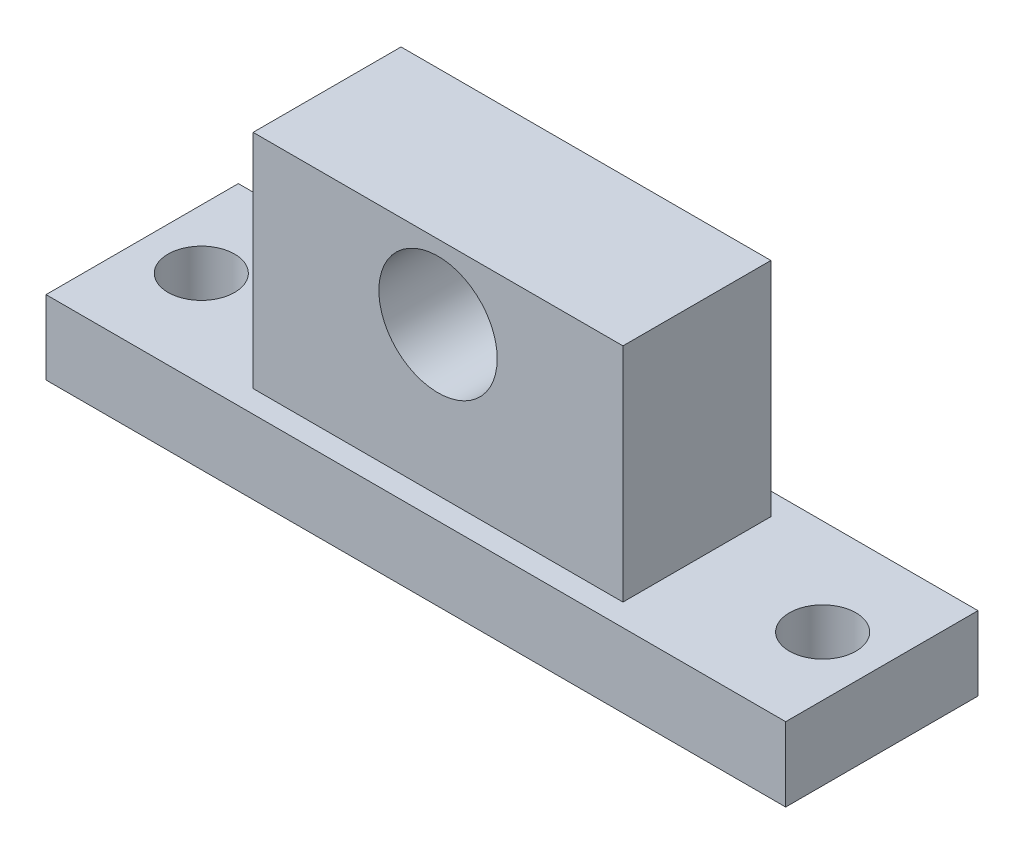
ISO-10303-21;
HEADER;
FILE_DESCRIPTION(('STEP AP214'),'2;1');
FILE_NAME('part.step','',(''),(''),'','','');
FILE_SCHEMA(('AUTOMOTIVE_DESIGN { 1 0 10303 214 1 1 1 1 }'));
ENDSEC;
DATA;
#1=APPLICATION_CONTEXT('core data for automotive mechanical design processes');
#2=APPLICATION_PROTOCOL_DEFINITION('international standard','automotive_design',2000,#1);
#3=PRODUCT_CONTEXT('',#1,'mechanical');
#4=PRODUCT('Part','Part','',(#3));
#5=PRODUCT_RELATED_PRODUCT_CATEGORY('part','',(#4));
#6=PRODUCT_DEFINITION_FORMATION('','',#4);
#7=PRODUCT_DEFINITION_CONTEXT('part definition',#1,'design');
#8=PRODUCT_DEFINITION('design','',#6,#7);
#9=PRODUCT_DEFINITION_SHAPE('','',#8);
#10=(LENGTH_UNIT() NAMED_UNIT(*) SI_UNIT(.MILLI.,.METRE.));
#11=(NAMED_UNIT(*) PLANE_ANGLE_UNIT() SI_UNIT($,.RADIAN.));
#12=(NAMED_UNIT(*) SI_UNIT($,.STERADIAN.) SOLID_ANGLE_UNIT());
#13=UNCERTAINTY_MEASURE_WITH_UNIT(LENGTH_MEASURE(1.E-05),#10,'distance_accuracy_value','');
#14=(GEOMETRIC_REPRESENTATION_CONTEXT(3) GLOBAL_UNCERTAINTY_ASSIGNED_CONTEXT((#13)) GLOBAL_UNIT_ASSIGNED_CONTEXT((#10,
#11,#12)) REPRESENTATION_CONTEXT('',''));
#15=CARTESIAN_POINT('',(0.,0.,0.));
#16=DIRECTION('',(0.,0.,1.));
#17=DIRECTION('',(1.,0.,0.));
#18=AXIS2_PLACEMENT_3D('',#15,#16,#17);
#19=CARTESIAN_POINT('',(0.,5.,0.));
#20=DIRECTION('',(0.,-1.,0.));
#21=DIRECTION('',(0.,0.,-1.));
#22=AXIS2_PLACEMENT_3D('',#19,#20,#21);
#23=PLANE('',#22);
#24=DIRECTION('',(0.,0.,-1.));
#25=VECTOR('',#24,1.);
#26=CARTESIAN_POINT('',(25.,5.,6.5));
#27=LINE('',#26,#25);
#28=CARTESIAN_POINT('',(25.,5.,6.5));
#29=VERTEX_POINT('',#28);
#30=CARTESIAN_POINT('',(25.,5.,-6.5));
#31=VERTEX_POINT('',#30);
#32=EDGE_CURVE('E152',#29,#31,#27,.T.);
#33=ORIENTED_EDGE('',*,*,#32,.T.);
#34=DIRECTION('',(-1.,0.,0.));
#35=VECTOR('',#34,1.);
#36=CARTESIAN_POINT('',(-25.,5.,-6.5));
#37=LINE('',#36,#35);
#38=CARTESIAN_POINT('',(-25.,5.,-6.5));
#39=VERTEX_POINT('',#38);
#40=EDGE_CURVE('E156',#31,#39,#37,.T.);
#41=ORIENTED_EDGE('',*,*,#40,.T.);
#42=DIRECTION('',(0.,0.,1.));
#43=VECTOR('',#42,1.);
#44=CARTESIAN_POINT('',(-25.,5.,6.5));
#45=LINE('',#44,#43);
#46=CARTESIAN_POINT('',(-25.,5.,6.5));
#47=VERTEX_POINT('',#46);
#48=EDGE_CURVE('E160',#39,#47,#45,.T.);
#49=ORIENTED_EDGE('',*,*,#48,.T.);
#50=DIRECTION('',(1.,0.,0.));
#51=VECTOR('',#50,1.);
#52=CARTESIAN_POINT('',(-25.,5.,6.5));
#53=LINE('',#52,#51);
#54=EDGE_CURVE('E163',#47,#29,#53,.T.);
#55=ORIENTED_EDGE('',*,*,#54,.T.);
#56=EDGE_LOOP('',(#33,#41,#49,#55));
#57=FACE_BOUND('',#56,.T.);
#58=CARTESIAN_POINT('',(21.,5.,0.));
#59=DIRECTION('',(0.,1.,0.));
#60=DIRECTION('',(0.,0.,1.));
#61=AXIS2_PLACEMENT_3D('',#58,#59,#60);
#62=CIRCLE('',#61,2.25);
#63=CARTESIAN_POINT('',(21.,5.,2.25));
#64=VERTEX_POINT('',#63);
#65=EDGE_CURVE('E129',#64,#64,#62,.T.);
#66=ORIENTED_EDGE('',*,*,#65,.F.);
#67=EDGE_LOOP('',(#66));
#68=FACE_BOUND('',#67,.T.);
#69=CARTESIAN_POINT('',(-21.,5.,0.));
#70=DIRECTION('',(0.,1.,0.));
#71=DIRECTION('',(0.,0.,1.));
#72=AXIS2_PLACEMENT_3D('',#69,#70,#71);
#73=CIRCLE('',#72,2.25);
#74=CARTESIAN_POINT('',(-21.,5.,2.25));
#75=VERTEX_POINT('',#74);
#76=EDGE_CURVE('E145',#75,#75,#73,.T.);
#77=ORIENTED_EDGE('',*,*,#76,.F.);
#78=EDGE_LOOP('',(#77));
#79=FACE_BOUND('',#78,.T.);
#80=DIRECTION('',(0.,0.,-1.));
#81=VECTOR('',#80,1.);
#82=CARTESIAN_POINT('',(12.5,5.,5.));
#83=LINE('',#82,#81);
#84=CARTESIAN_POINT('',(12.5,5.,5.));
#85=VERTEX_POINT('',#84);
#86=CARTESIAN_POINT('',(12.5,5.,-5.));
#87=VERTEX_POINT('',#86);
#88=EDGE_CURVE('E127',#85,#87,#83,.T.);
#89=ORIENTED_EDGE('',*,*,#88,.F.);
#90=DIRECTION('',(1.,0.,0.));
#91=VECTOR('',#90,1.);
#92=CARTESIAN_POINT('',(-12.5,5.,5.));
#93=LINE('',#92,#91);
#94=CARTESIAN_POINT('',(-12.5,5.,5.));
#95=VERTEX_POINT('',#94);
#96=EDGE_CURVE('E124',#95,#85,#93,.T.);
#97=ORIENTED_EDGE('',*,*,#96,.F.);
#98=DIRECTION('',(0.,0.,1.));
#99=VECTOR('',#98,1.);
#100=CARTESIAN_POINT('',(-12.5,5.,5.));
#101=LINE('',#100,#99);
#102=CARTESIAN_POINT('',(-12.5,5.,-5.));
#103=VERTEX_POINT('',#102);
#104=EDGE_CURVE('E60',#103,#95,#101,.T.);
#105=ORIENTED_EDGE('',*,*,#104,.F.);
#106=DIRECTION('',(-1.,0.,0.));
#107=VECTOR('',#106,1.);
#108=CARTESIAN_POINT('',(-12.5,5.,-5.));
#109=LINE('',#108,#107);
#110=EDGE_CURVE('E55',#87,#103,#109,.T.);
#111=ORIENTED_EDGE('',*,*,#110,.F.);
#112=EDGE_LOOP('',(#89,#97,#105,#111));
#113=FACE_BOUND('',#112,.T.);
#114=ADVANCED_FACE('F39',(#57,#68,#79,#113),#23,.F.);
#115=CARTESIAN_POINT('',(25.,5.,6.5));
#116=DIRECTION('',(-1.,0.,0.));
#117=DIRECTION('',(0.,0.,1.));
#118=AXIS2_PLACEMENT_3D('',#115,#116,#117);
#119=PLANE('',#118);
#120=DIRECTION('',(0.,0.,-1.));
#121=VECTOR('',#120,1.);
#122=CARTESIAN_POINT('',(25.,0.,6.5));
#123=LINE('',#122,#121);
#124=CARTESIAN_POINT('',(25.,0.,6.5));
#125=VERTEX_POINT('',#124);
#126=CARTESIAN_POINT('',(25.,0.,-6.5));
#127=VERTEX_POINT('',#126);
#128=EDGE_CURVE('E144',#125,#127,#123,.T.);
#129=ORIENTED_EDGE('',*,*,#128,.T.);
#130=DIRECTION('',(0.,-1.,0.));
#131=VECTOR('',#130,1.);
#132=CARTESIAN_POINT('',(25.,5.,-6.5));
#133=LINE('',#132,#131);
#134=EDGE_CURVE('E11',#31,#127,#133,.T.);
#135=ORIENTED_EDGE('',*,*,#134,.F.);
#136=ORIENTED_EDGE('',*,*,#32,.F.);
#137=DIRECTION('',(0.,-1.,0.));
#138=VECTOR('',#137,1.);
#139=CARTESIAN_POINT('',(25.,5.,6.5));
#140=LINE('',#139,#138);
#141=EDGE_CURVE('E166',#29,#125,#140,.T.);
#142=ORIENTED_EDGE('',*,*,#141,.T.);
#143=EDGE_LOOP('',(#129,#135,#136,#142));
#144=FACE_BOUND('',#143,.T.);
#145=ADVANCED_FACE('F41',(#144),#119,.F.);
#146=CARTESIAN_POINT('',(-25.,5.,-6.5));
#147=DIRECTION('',(0.,0.,1.));
#148=DIRECTION('',(1.,0.,0.));
#149=AXIS2_PLACEMENT_3D('',#146,#147,#148);
#150=PLANE('',#149);
#151=DIRECTION('',(-1.,0.,0.));
#152=VECTOR('',#151,1.);
#153=CARTESIAN_POINT('',(-25.,0.,-6.5));
#154=LINE('',#153,#152);
#155=CARTESIAN_POINT('',(-25.,0.,-6.5));
#156=VERTEX_POINT('',#155);
#157=EDGE_CURVE('E170',#127,#156,#154,.T.);
#158=ORIENTED_EDGE('',*,*,#157,.T.);
#159=DIRECTION('',(0.,-1.,0.));
#160=VECTOR('',#159,1.);
#161=CARTESIAN_POINT('',(-25.,5.,-6.5));
#162=LINE('',#161,#160);
#163=EDGE_CURVE('E48',#39,#156,#162,.T.);
#164=ORIENTED_EDGE('',*,*,#163,.F.);
#165=ORIENTED_EDGE('',*,*,#40,.F.);
#166=ORIENTED_EDGE('',*,*,#134,.T.);
#167=EDGE_LOOP('',(#158,#164,#165,#166));
#168=FACE_BOUND('',#167,.T.);
#169=ADVANCED_FACE('F206',(#168),#150,.F.);
#170=CARTESIAN_POINT('',(-25.,5.,6.5));
#171=DIRECTION('',(1.,0.,0.));
#172=DIRECTION('',(0.,0.,-1.));
#173=AXIS2_PLACEMENT_3D('',#170,#171,#172);
#174=PLANE('',#173);
#175=DIRECTION('',(0.,0.,1.));
#176=VECTOR('',#175,1.);
#177=CARTESIAN_POINT('',(-25.,0.,6.5));
#178=LINE('',#177,#176);
#179=CARTESIAN_POINT('',(-25.,0.,6.5));
#180=VERTEX_POINT('',#179);
#181=EDGE_CURVE('E173',#156,#180,#178,.T.);
#182=ORIENTED_EDGE('',*,*,#181,.T.);
#183=DIRECTION('',(0.,-1.,0.));
#184=VECTOR('',#183,1.);
#185=CARTESIAN_POINT('',(-25.,5.,6.5));
#186=LINE('',#185,#184);
#187=EDGE_CURVE('E181',#47,#180,#186,.T.);
#188=ORIENTED_EDGE('',*,*,#187,.F.);
#189=ORIENTED_EDGE('',*,*,#48,.F.);
#190=ORIENTED_EDGE('',*,*,#163,.T.);
#191=EDGE_LOOP('',(#182,#188,#189,#190));
#192=FACE_BOUND('',#191,.T.);
#193=ADVANCED_FACE('F190',(#192),#174,.F.);
#194=CARTESIAN_POINT('',(-25.,5.,6.5));
#195=DIRECTION('',(0.,0.,-1.));
#196=DIRECTION('',(-1.,0.,0.));
#197=AXIS2_PLACEMENT_3D('',#194,#195,#196);
#198=PLANE('',#197);
#199=DIRECTION('',(1.,0.,0.));
#200=VECTOR('',#199,1.);
#201=CARTESIAN_POINT('',(-25.,0.,6.5));
#202=LINE('',#201,#200);
#203=EDGE_CURVE('E157',#180,#125,#202,.T.);
#204=ORIENTED_EDGE('',*,*,#203,.T.);
#205=ORIENTED_EDGE('',*,*,#141,.F.);
#206=ORIENTED_EDGE('',*,*,#54,.F.);
#207=ORIENTED_EDGE('',*,*,#187,.T.);
#208=EDGE_LOOP('',(#204,#205,#206,#207));
#209=FACE_BOUND('',#208,.T.);
#210=ADVANCED_FACE('F199',(#209),#198,.F.);
#211=CARTESIAN_POINT('',(0.,0.,0.));
#212=DIRECTION('',(0.,-1.,0.));
#213=DIRECTION('',(0.,0.,-1.));
#214=AXIS2_PLACEMENT_3D('',#211,#212,#213);
#215=PLANE('',#214);
#216=CARTESIAN_POINT('',(-21.,0.,0.));
#217=DIRECTION('',(0.,1.,0.));
#218=DIRECTION('',(0.,0.,1.));
#219=AXIS2_PLACEMENT_3D('',#216,#217,#218);
#220=CIRCLE('',#219,2.25);
#221=CARTESIAN_POINT('',(-21.,0.,2.25));
#222=VERTEX_POINT('',#221);
#223=EDGE_CURVE('E140',#222,#222,#220,.T.);
#224=ORIENTED_EDGE('',*,*,#223,.T.);
#225=EDGE_LOOP('',(#224));
#226=FACE_BOUND('',#225,.T.);
#227=CARTESIAN_POINT('',(21.,0.,0.));
#228=DIRECTION('',(0.,1.,0.));
#229=DIRECTION('',(0.,0.,1.));
#230=AXIS2_PLACEMENT_3D('',#227,#228,#229);
#231=CIRCLE('',#230,2.25);
#232=CARTESIAN_POINT('',(21.,0.,2.25));
#233=VERTEX_POINT('',#232);
#234=EDGE_CURVE('E134',#233,#233,#231,.T.);
#235=ORIENTED_EDGE('',*,*,#234,.T.);
#236=EDGE_LOOP('',(#235));
#237=FACE_BOUND('',#236,.T.);
#238=ORIENTED_EDGE('',*,*,#128,.F.);
#239=ORIENTED_EDGE('',*,*,#203,.F.);
#240=ORIENTED_EDGE('',*,*,#181,.F.);
#241=ORIENTED_EDGE('',*,*,#157,.F.);
#242=EDGE_LOOP('',(#238,#239,#240,#241));
#243=FACE_BOUND('',#242,.T.);
#244=ADVANCED_FACE('F196',(#226,#237,#243),#215,.T.);
#245=CARTESIAN_POINT('',(21.,0.,0.));
#246=DIRECTION('',(0.,1.,0.));
#247=DIRECTION('',(0.,0.,1.));
#248=AXIS2_PLACEMENT_3D('',#245,#246,#247);
#249=CYLINDRICAL_SURFACE('',#248,2.25);
#250=ORIENTED_EDGE('',*,*,#234,.F.);
#251=EDGE_LOOP('',(#250));
#252=FACE_BOUND('',#251,.T.);
#253=ORIENTED_EDGE('',*,*,#65,.T.);
#254=EDGE_LOOP('',(#253));
#255=FACE_BOUND('',#254,.T.);
#256=ADVANCED_FACE('F219',(#252,#255),#249,.F.);
#257=CARTESIAN_POINT('',(-21.,0.,0.));
#258=DIRECTION('',(0.,1.,0.));
#259=DIRECTION('',(0.,0.,1.));
#260=AXIS2_PLACEMENT_3D('',#257,#258,#259);
#261=CYLINDRICAL_SURFACE('',#260,2.25);
#262=ORIENTED_EDGE('',*,*,#223,.F.);
#263=EDGE_LOOP('',(#262));
#264=FACE_BOUND('',#263,.T.);
#265=ORIENTED_EDGE('',*,*,#76,.T.);
#266=EDGE_LOOP('',(#265));
#267=FACE_BOUND('',#266,.T.);
#268=ADVANCED_FACE('F239',(#264,#267),#261,.F.);
#269=CARTESIAN_POINT('',(12.5,20.,5.));
#270=DIRECTION('',(-1.,0.,0.));
#271=DIRECTION('',(0.,0.,1.));
#272=AXIS2_PLACEMENT_3D('',#269,#270,#271);
#273=PLANE('',#272);
#274=ORIENTED_EDGE('',*,*,#88,.T.);
#275=DIRECTION('',(0.,-1.,0.));
#276=VECTOR('',#275,1.);
#277=CARTESIAN_POINT('',(12.5,20.,-5.));
#278=LINE('',#277,#276);
#279=CARTESIAN_POINT('',(12.5,20.,-5.));
#280=VERTEX_POINT('',#279);
#281=EDGE_CURVE('E106',#280,#87,#278,.T.);
#282=ORIENTED_EDGE('',*,*,#281,.F.);
#283=DIRECTION('',(0.,0.,-1.));
#284=VECTOR('',#283,1.);
#285=CARTESIAN_POINT('',(12.5,20.,5.));
#286=LINE('',#285,#284);
#287=CARTESIAN_POINT('',(12.5,20.,5.));
#288=VERTEX_POINT('',#287);
#289=EDGE_CURVE('E114',#288,#280,#286,.T.);
#290=ORIENTED_EDGE('',*,*,#289,.F.);
#291=DIRECTION('',(0.,-1.,0.));
#292=VECTOR('',#291,1.);
#293=CARTESIAN_POINT('',(12.5,20.,5.));
#294=LINE('',#293,#292);
#295=EDGE_CURVE('E346',#288,#85,#294,.T.);
#296=ORIENTED_EDGE('',*,*,#295,.T.);
#297=EDGE_LOOP('',(#274,#282,#290,#296));
#298=FACE_BOUND('',#297,.T.);
#299=ADVANCED_FACE('F126',(#298),#273,.F.);
#300=CARTESIAN_POINT('',(-12.5,20.,-5.));
#301=DIRECTION('',(0.,0.,1.));
#302=DIRECTION('',(1.,0.,0.));
#303=AXIS2_PLACEMENT_3D('',#300,#301,#302);
#304=PLANE('',#303);
#305=CARTESIAN_POINT('',(0.,15.,-5.));
#306=DIRECTION('',(0.,0.,1.));
#307=DIRECTION('',(1.,0.,0.));
#308=AXIS2_PLACEMENT_3D('',#305,#306,#307);
#309=CIRCLE('',#308,4.);
#310=CARTESIAN_POINT('',(4.,15.,-5.));
#311=VERTEX_POINT('',#310);
#312=EDGE_CURVE('E335',#311,#311,#309,.T.);
#313=ORIENTED_EDGE('',*,*,#312,.T.);
#314=EDGE_LOOP('',(#313));
#315=FACE_BOUND('',#314,.T.);
#316=ORIENTED_EDGE('',*,*,#110,.T.);
#317=DIRECTION('',(0.,-1.,0.));
#318=VECTOR('',#317,1.);
#319=CARTESIAN_POINT('',(-12.5,20.,-5.));
#320=LINE('',#319,#318);
#321=CARTESIAN_POINT('',(-12.5,20.,-5.));
#322=VERTEX_POINT('',#321);
#323=EDGE_CURVE('E109',#322,#103,#320,.T.);
#324=ORIENTED_EDGE('',*,*,#323,.F.);
#325=DIRECTION('',(-1.,0.,0.));
#326=VECTOR('',#325,1.);
#327=CARTESIAN_POINT('',(-12.5,20.,-5.));
#328=LINE('',#327,#326);
#329=EDGE_CURVE('E102',#280,#322,#328,.T.);
#330=ORIENTED_EDGE('',*,*,#329,.F.);
#331=ORIENTED_EDGE('',*,*,#281,.T.);
#332=EDGE_LOOP('',(#316,#324,#330,#331));
#333=FACE_BOUND('',#332,.T.);
#334=ADVANCED_FACE('F104',(#315,#333),#304,.F.);
#335=CARTESIAN_POINT('',(-12.5,20.,5.));
#336=DIRECTION('',(1.,0.,0.));
#337=DIRECTION('',(0.,0.,-1.));
#338=AXIS2_PLACEMENT_3D('',#335,#336,#337);
#339=PLANE('',#338);
#340=ORIENTED_EDGE('',*,*,#104,.T.);
#341=DIRECTION('',(0.,-1.,0.));
#342=VECTOR('',#341,1.);
#343=CARTESIAN_POINT('',(-12.5,20.,5.));
#344=LINE('',#343,#342);
#345=CARTESIAN_POINT('',(-12.5,20.,5.));
#346=VERTEX_POINT('',#345);
#347=EDGE_CURVE('E136',#346,#95,#344,.T.);
#348=ORIENTED_EDGE('',*,*,#347,.F.);
#349=DIRECTION('',(0.,0.,1.));
#350=VECTOR('',#349,1.);
#351=CARTESIAN_POINT('',(-12.5,20.,5.));
#352=LINE('',#351,#350);
#353=EDGE_CURVE('E113',#322,#346,#352,.T.);
#354=ORIENTED_EDGE('',*,*,#353,.F.);
#355=ORIENTED_EDGE('',*,*,#323,.T.);
#356=EDGE_LOOP('',(#340,#348,#354,#355));
#357=FACE_BOUND('',#356,.T.);
#358=ADVANCED_FACE('F259',(#357),#339,.F.);
#359=CARTESIAN_POINT('',(-12.5,20.,5.));
#360=DIRECTION('',(0.,0.,-1.));
#361=DIRECTION('',(-1.,0.,0.));
#362=AXIS2_PLACEMENT_3D('',#359,#360,#361);
#363=PLANE('',#362);
#364=CARTESIAN_POINT('',(0.,15.,5.));
#365=DIRECTION('',(0.,0.,1.));
#366=DIRECTION('',(1.,0.,0.));
#367=AXIS2_PLACEMENT_3D('',#364,#365,#366);
#368=CIRCLE('',#367,4.);
#369=CARTESIAN_POINT('',(4.,15.,5.));
#370=VERTEX_POINT('',#369);
#371=EDGE_CURVE('E332',#370,#370,#368,.T.);
#372=ORIENTED_EDGE('',*,*,#371,.F.);
#373=EDGE_LOOP('',(#372));
#374=FACE_BOUND('',#373,.T.);
#375=ORIENTED_EDGE('',*,*,#96,.T.);
#376=ORIENTED_EDGE('',*,*,#295,.F.);
#377=DIRECTION('',(1.,0.,0.));
#378=VECTOR('',#377,1.);
#379=CARTESIAN_POINT('',(-12.5,20.,5.));
#380=LINE('',#379,#378);
#381=EDGE_CURVE('E119',#346,#288,#380,.T.);
#382=ORIENTED_EDGE('',*,*,#381,.F.);
#383=ORIENTED_EDGE('',*,*,#347,.T.);
#384=EDGE_LOOP('',(#375,#376,#382,#383));
#385=FACE_BOUND('',#384,.T.);
#386=ADVANCED_FACE('F268',(#374,#385),#363,.F.);
#387=CARTESIAN_POINT('',(0.,20.,0.));
#388=DIRECTION('',(0.,-1.,0.));
#389=DIRECTION('',(0.,0.,-1.));
#390=AXIS2_PLACEMENT_3D('',#387,#388,#389);
#391=PLANE('',#390);
#392=ORIENTED_EDGE('',*,*,#289,.T.);
#393=ORIENTED_EDGE('',*,*,#329,.T.);
#394=ORIENTED_EDGE('',*,*,#353,.T.);
#395=ORIENTED_EDGE('',*,*,#381,.T.);
#396=EDGE_LOOP('',(#392,#393,#394,#395));
#397=FACE_BOUND('',#396,.T.);
#398=ADVANCED_FACE('F117',(#397),#391,.F.);
#399=CARTESIAN_POINT('',(0.,15.,-10.));
#400=DIRECTION('',(0.,0.,1.));
#401=DIRECTION('',(1.,0.,0.));
#402=AXIS2_PLACEMENT_3D('',#399,#400,#401);
#403=CYLINDRICAL_SURFACE('',#402,4.);
#404=ORIENTED_EDGE('',*,*,#371,.T.);
#405=EDGE_LOOP('',(#404));
#406=FACE_BOUND('',#405,.T.);
#407=ORIENTED_EDGE('',*,*,#312,.F.);
#408=EDGE_LOOP('',(#407));
#409=FACE_BOUND('',#408,.T.);
#410=ADVANCED_FACE('F282',(#406,#409),#403,.F.);
#411=CLOSED_SHELL('',(#114,#145,#169,#193,#210,#244,#256,#268,#299,#334,#358,#386,#398,#410));
#412=MANIFOLD_SOLID_BREP('B2',#411);
#413=ADVANCED_BREP_SHAPE_REPRESENTATION('',(#18,#412),#14);
#414=SHAPE_DEFINITION_REPRESENTATION(#9,#413);
ENDSEC;
END-ISO-10303-21;
